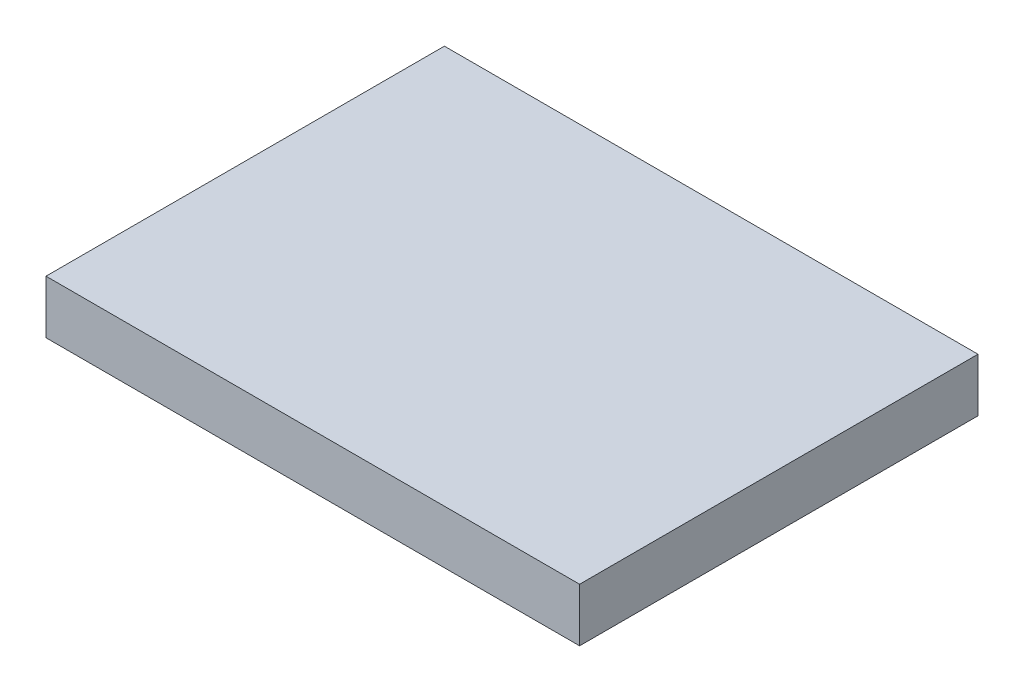
ISO-10303-21;
HEADER;
FILE_DESCRIPTION(('STEP AP214'),'2;1');
FILE_NAME('part.step','',(''),(''),'','','');
FILE_SCHEMA(('AUTOMOTIVE_DESIGN { 1 0 10303 214 1 1 1 1 }'));
ENDSEC;
DATA;
#1=APPLICATION_CONTEXT('core data for automotive mechanical design processes');
#2=APPLICATION_PROTOCOL_DEFINITION('international standard','automotive_design',2000,#1);
#3=PRODUCT_CONTEXT('',#1,'mechanical');
#4=PRODUCT('Part','Part','',(#3));
#5=PRODUCT_RELATED_PRODUCT_CATEGORY('part','',(#4));
#6=PRODUCT_DEFINITION_FORMATION('','',#4);
#7=PRODUCT_DEFINITION_CONTEXT('part definition',#1,'design');
#8=PRODUCT_DEFINITION('design','',#6,#7);
#9=PRODUCT_DEFINITION_SHAPE('','',#8);
#10=(LENGTH_UNIT() NAMED_UNIT(*) SI_UNIT(.MILLI.,.METRE.));
#11=(NAMED_UNIT(*) PLANE_ANGLE_UNIT() SI_UNIT($,.RADIAN.));
#12=(NAMED_UNIT(*) SI_UNIT($,.STERADIAN.) SOLID_ANGLE_UNIT());
#13=UNCERTAINTY_MEASURE_WITH_UNIT(LENGTH_MEASURE(1.E-05),#10,'distance_accuracy_value','');
#14=(GEOMETRIC_REPRESENTATION_CONTEXT(3) GLOBAL_UNCERTAINTY_ASSIGNED_CONTEXT((#13)) GLOBAL_UNIT_ASSIGNED_CONTEXT((#10,
#11,#12)) REPRESENTATION_CONTEXT('',''));
#15=CARTESIAN_POINT('',(0.,0.,0.));
#16=DIRECTION('',(0.,0.,1.));
#17=DIRECTION('',(1.,0.,0.));
#18=AXIS2_PLACEMENT_3D('',#15,#16,#17);
#19=CARTESIAN_POINT('',(-952.5,190.5,711.2));
#20=DIRECTION('',(0.,0.,-1.));
#21=DIRECTION('',(-1.,0.,0.));
#22=AXIS2_PLACEMENT_3D('',#19,#20,#21);
#23=PLANE('',#22);
#24=DIRECTION('',(1.,0.,0.));
#25=VECTOR('',#24,1.);
#26=CARTESIAN_POINT('',(-952.5,0.,711.2));
#27=LINE('',#26,#25);
#28=CARTESIAN_POINT('',(-952.5,0.,711.2));
#29=VERTEX_POINT('',#28);
#30=CARTESIAN_POINT('',(952.5,0.,711.2));
#31=VERTEX_POINT('',#30);
#32=EDGE_CURVE('E95',#29,#31,#27,.T.);
#33=ORIENTED_EDGE('',*,*,#32,.T.);
#34=DIRECTION('',(0.,-1.,0.));
#35=VECTOR('',#34,1.);
#36=CARTESIAN_POINT('',(952.5,190.5,711.2));
#37=LINE('',#36,#35);
#38=CARTESIAN_POINT('',(952.5,190.5,711.2));
#39=VERTEX_POINT('',#38);
#40=EDGE_CURVE('E11',#39,#31,#37,.T.);
#41=ORIENTED_EDGE('',*,*,#40,.F.);
#42=DIRECTION('',(1.,0.,0.));
#43=VECTOR('',#42,1.);
#44=CARTESIAN_POINT('',(-952.5,190.5,711.2));
#45=LINE('',#44,#43);
#46=CARTESIAN_POINT('',(-952.5,190.5,711.2));
#47=VERTEX_POINT('',#46);
#48=EDGE_CURVE('E81',#47,#39,#45,.T.);
#49=ORIENTED_EDGE('',*,*,#48,.F.);
#50=DIRECTION('',(0.,-1.,0.));
#51=VECTOR('',#50,1.);
#52=CARTESIAN_POINT('',(-952.5,190.5,711.2));
#53=LINE('',#52,#51);
#54=EDGE_CURVE('E48',#47,#29,#53,.T.);
#55=ORIENTED_EDGE('',*,*,#54,.T.);
#56=EDGE_LOOP('',(#33,#41,#49,#55));
#57=FACE_BOUND('',#56,.T.);
#58=ADVANCED_FACE('F32',(#57),#23,.F.);
#59=CARTESIAN_POINT('',(952.5,190.5,711.2));
#60=DIRECTION('',(-1.,0.,0.));
#61=DIRECTION('',(0.,0.,1.));
#62=AXIS2_PLACEMENT_3D('',#59,#60,#61);
#63=PLANE('',#62);
#64=DIRECTION('',(0.,0.,-1.));
#65=VECTOR('',#64,1.);
#66=CARTESIAN_POINT('',(952.5,0.,711.2));
#67=LINE('',#66,#65);
#68=CARTESIAN_POINT('',(952.5,0.,-711.2));
#69=VERTEX_POINT('',#68);
#70=EDGE_CURVE('E86',#31,#69,#67,.T.);
#71=ORIENTED_EDGE('',*,*,#70,.T.);
#72=DIRECTION('',(0.,-1.,0.));
#73=VECTOR('',#72,1.);
#74=CARTESIAN_POINT('',(952.5,190.5,-711.2));
#75=LINE('',#74,#73);
#76=CARTESIAN_POINT('',(952.5,190.5,-711.2));
#77=VERTEX_POINT('',#76);
#78=EDGE_CURVE('E40',#77,#69,#75,.T.);
#79=ORIENTED_EDGE('',*,*,#78,.F.);
#80=DIRECTION('',(0.,0.,-1.));
#81=VECTOR('',#80,1.);
#82=CARTESIAN_POINT('',(952.5,190.5,711.2));
#83=LINE('',#82,#81);
#84=EDGE_CURVE('E73',#39,#77,#83,.T.);
#85=ORIENTED_EDGE('',*,*,#84,.F.);
#86=ORIENTED_EDGE('',*,*,#40,.T.);
#87=EDGE_LOOP('',(#71,#79,#85,#86));
#88=FACE_BOUND('',#87,.T.);
#89=ADVANCED_FACE('F85',(#88),#63,.F.);
#90=CARTESIAN_POINT('',(-952.5,190.5,-711.2));
#91=DIRECTION('',(0.,0.,-1.));
#92=DIRECTION('',(-1.,0.,0.));
#93=AXIS2_PLACEMENT_3D('',#90,#91,#92);
#94=PLANE('',#93);
#95=DIRECTION('',(1.,0.,0.));
#96=VECTOR('',#95,1.);
#97=CARTESIAN_POINT('',(-952.5,0.,-711.2));
#98=LINE('',#97,#96);
#99=CARTESIAN_POINT('',(-952.5,0.,-711.2));
#100=VERTEX_POINT('',#99);
#101=EDGE_CURVE('E98',#100,#69,#98,.T.);
#102=ORIENTED_EDGE('',*,*,#101,.F.);
#103=DIRECTION('',(0.,-1.,0.));
#104=VECTOR('',#103,1.);
#105=CARTESIAN_POINT('',(-952.5,190.5,-711.2));
#106=LINE('',#105,#104);
#107=CARTESIAN_POINT('',(-952.5,190.5,-711.2));
#108=VERTEX_POINT('',#107);
#109=EDGE_CURVE('E62',#108,#100,#106,.T.);
#110=ORIENTED_EDGE('',*,*,#109,.F.);
#111=DIRECTION('',(1.,0.,0.));
#112=VECTOR('',#111,1.);
#113=CARTESIAN_POINT('',(-952.5,190.5,-711.2));
#114=LINE('',#113,#112);
#115=EDGE_CURVE('E80',#108,#77,#114,.T.);
#116=ORIENTED_EDGE('',*,*,#115,.T.);
#117=ORIENTED_EDGE('',*,*,#78,.T.);
#118=EDGE_LOOP('',(#102,#110,#116,#117));
#119=FACE_BOUND('',#118,.T.);
#120=ADVANCED_FACE('F89',(#119),#94,.T.);
#121=CARTESIAN_POINT('',(-952.5,190.5,711.2));
#122=DIRECTION('',(-1.,0.,0.));
#123=DIRECTION('',(0.,0.,1.));
#124=AXIS2_PLACEMENT_3D('',#121,#122,#123);
#125=PLANE('',#124);
#126=DIRECTION('',(0.,0.,-1.));
#127=VECTOR('',#126,1.);
#128=CARTESIAN_POINT('',(-952.5,0.,711.2));
#129=LINE('',#128,#127);
#130=EDGE_CURVE('E100',#29,#100,#129,.T.);
#131=ORIENTED_EDGE('',*,*,#130,.F.);
#132=ORIENTED_EDGE('',*,*,#54,.F.);
#133=DIRECTION('',(0.,0.,-1.));
#134=VECTOR('',#133,1.);
#135=CARTESIAN_POINT('',(-952.5,190.5,711.2));
#136=LINE('',#135,#134);
#137=EDGE_CURVE('E90',#47,#108,#136,.T.);
#138=ORIENTED_EDGE('',*,*,#137,.T.);
#139=ORIENTED_EDGE('',*,*,#109,.T.);
#140=EDGE_LOOP('',(#131,#132,#138,#139));
#141=FACE_BOUND('',#140,.T.);
#142=ADVANCED_FACE('F106',(#141),#125,.T.);
#143=CARTESIAN_POINT('',(0.,190.5,0.));
#144=DIRECTION('',(0.,1.,0.));
#145=DIRECTION('',(0.,0.,1.));
#146=AXIS2_PLACEMENT_3D('',#143,#144,#145);
#147=PLANE('',#146);
#148=ORIENTED_EDGE('',*,*,#48,.T.);
#149=ORIENTED_EDGE('',*,*,#84,.T.);
#150=ORIENTED_EDGE('',*,*,#115,.F.);
#151=ORIENTED_EDGE('',*,*,#137,.F.);
#152=EDGE_LOOP('',(#148,#149,#150,#151));
#153=FACE_BOUND('',#152,.T.);
#154=ADVANCED_FACE('F77',(#153),#147,.T.);
#155=CARTESIAN_POINT('',(0.,0.,0.));
#156=DIRECTION('',(0.,1.,0.));
#157=DIRECTION('',(0.,0.,1.));
#158=AXIS2_PLACEMENT_3D('',#155,#156,#157);
#159=PLANE('',#158);
#160=ORIENTED_EDGE('',*,*,#32,.F.);
#161=ORIENTED_EDGE('',*,*,#130,.T.);
#162=ORIENTED_EDGE('',*,*,#101,.T.);
#163=ORIENTED_EDGE('',*,*,#70,.F.);
#164=EDGE_LOOP('',(#160,#161,#162,#163));
#165=FACE_BOUND('',#164,.T.);
#166=ADVANCED_FACE('F105',(#165),#159,.F.);
#167=CLOSED_SHELL('',(#58,#89,#120,#142,#154,#166));
#168=MANIFOLD_SOLID_BREP('B2',#167);
#169=ADVANCED_BREP_SHAPE_REPRESENTATION('',(#18,#168),#14);
#170=SHAPE_DEFINITION_REPRESENTATION(#9,#169);
ENDSEC;
END-ISO-10303-21;
